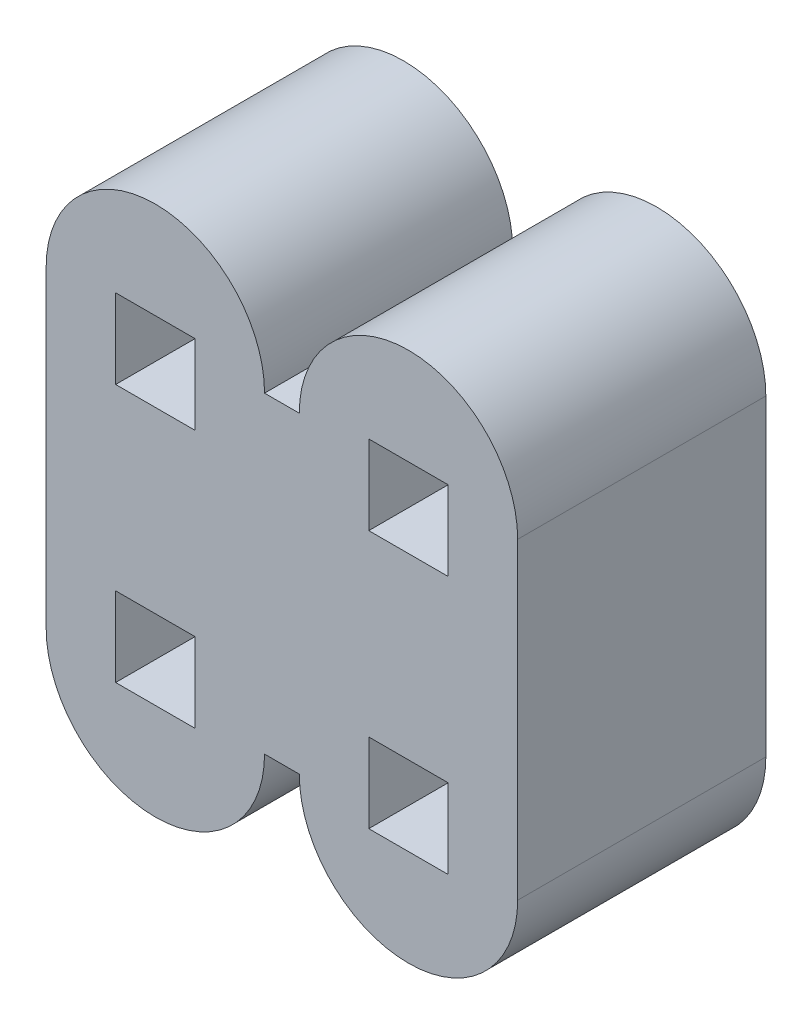
ISO-10303-21;
HEADER;
FILE_DESCRIPTION(('STEP AP214'),'2;1');
FILE_NAME('part.step','',(''),(''),'','','');
FILE_SCHEMA(('AUTOMOTIVE_DESIGN { 1 0 10303 214 1 1 1 1 }'));
ENDSEC;
DATA;
#1=APPLICATION_CONTEXT('core data for automotive mechanical design processes');
#2=APPLICATION_PROTOCOL_DEFINITION('international standard','automotive_design',2000,#1);
#3=PRODUCT_CONTEXT('',#1,'mechanical');
#4=PRODUCT('Part','Part','',(#3));
#5=PRODUCT_RELATED_PRODUCT_CATEGORY('part','',(#4));
#6=PRODUCT_DEFINITION_FORMATION('','',#4);
#7=PRODUCT_DEFINITION_CONTEXT('part definition',#1,'design');
#8=PRODUCT_DEFINITION('design','',#6,#7);
#9=PRODUCT_DEFINITION_SHAPE('','',#8);
#10=(LENGTH_UNIT() NAMED_UNIT(*) SI_UNIT(.MILLI.,.METRE.));
#11=(NAMED_UNIT(*) PLANE_ANGLE_UNIT() SI_UNIT($,.RADIAN.));
#12=(NAMED_UNIT(*) SI_UNIT($,.STERADIAN.) SOLID_ANGLE_UNIT());
#13=UNCERTAINTY_MEASURE_WITH_UNIT(LENGTH_MEASURE(1.E-05),#10,'distance_accuracy_value','');
#14=(GEOMETRIC_REPRESENTATION_CONTEXT(3) GLOBAL_UNCERTAINTY_ASSIGNED_CONTEXT((#13)) GLOBAL_UNIT_ASSIGNED_CONTEXT((#10,
#11,#12)) REPRESENTATION_CONTEXT('',''));
#15=CARTESIAN_POINT('',(0.,0.,0.));
#16=DIRECTION('',(0.,0.,1.));
#17=DIRECTION('',(1.,0.,0.));
#18=AXIS2_PLACEMENT_3D('',#15,#16,#17);
#19=CARTESIAN_POINT('',(-13.9966399599787,-19.5900833063968,2.5));
#20=DIRECTION('',(0.,0.,-1.));
#21=DIRECTION('',(-1.,0.,0.));
#22=AXIS2_PLACEMENT_3D('',#19,#20,#21);
#23=CYLINDRICAL_SURFACE('',#22,1.1);
#24=CARTESIAN_POINT('',(-13.9966399599787,-19.5900833063968,0.));
#25=DIRECTION('',(0.,0.,1.));
#26=DIRECTION('',(1.,0.,0.));
#27=AXIS2_PLACEMENT_3D('',#24,#25,#26);
#28=CIRCLE('',#27,1.1);
#29=CARTESIAN_POINT('',(-15.0966399599787,-19.5900833063968,0.));
#30=VERTEX_POINT('',#29);
#31=CARTESIAN_POINT('',(-12.8966399599787,-19.5900833063968,0.));
#32=VERTEX_POINT('',#31);
#33=EDGE_CURVE('E320',#30,#32,#28,.T.);
#34=ORIENTED_EDGE('',*,*,#33,.T.);
#35=DIRECTION('',(0.,0.,-1.));
#36=VECTOR('',#35,1.);
#37=CARTESIAN_POINT('',(-12.8966399599787,-19.5900833063968,2.5));
#38=LINE('',#37,#36);
#39=CARTESIAN_POINT('',(-12.8966399599787,-19.5900833063968,2.5));
#40=VERTEX_POINT('',#39);
#41=EDGE_CURVE('E11',#40,#32,#38,.T.);
#42=ORIENTED_EDGE('',*,*,#41,.F.);
#43=CARTESIAN_POINT('',(-13.9966399599787,-19.5900833063968,2.5));
#44=DIRECTION('',(0.,0.,1.));
#45=DIRECTION('',(1.,0.,0.));
#46=AXIS2_PLACEMENT_3D('',#43,#44,#45);
#47=CIRCLE('',#46,1.1);
#48=CARTESIAN_POINT('',(-15.0966399599787,-19.5900833063968,2.5));
#49=VERTEX_POINT('',#48);
#50=EDGE_CURVE('E327',#49,#40,#47,.T.);
#51=ORIENTED_EDGE('',*,*,#50,.F.);
#52=DIRECTION('',(0.,0.,-1.));
#53=VECTOR('',#52,1.);
#54=CARTESIAN_POINT('',(-15.0966399599787,-19.5900833063968,2.5));
#55=LINE('',#54,#53);
#56=EDGE_CURVE('E347',#49,#30,#55,.T.);
#57=ORIENTED_EDGE('',*,*,#56,.T.);
#58=EDGE_LOOP('',(#34,#42,#51,#57));
#59=FACE_BOUND('',#58,.T.);
#60=ADVANCED_FACE('F34',(#59),#23,.T.);
#61=CARTESIAN_POINT('',(0.,-19.5900833063968,2.5));
#62=DIRECTION('',(0.,1.,0.));
#63=DIRECTION('',(0.,0.,1.));
#64=AXIS2_PLACEMENT_3D('',#61,#62,#63);
#65=PLANE('',#64);
#66=DIRECTION('',(1.,0.,0.));
#67=VECTOR('',#66,1.);
#68=CARTESIAN_POINT('',(0.,-19.5900833063968,0.));
#69=LINE('',#68,#67);
#70=CARTESIAN_POINT('',(-12.5466399599787,-19.5900833063968,0.));
#71=VERTEX_POINT('',#70);
#72=EDGE_CURVE('E350',#32,#71,#69,.T.);
#73=ORIENTED_EDGE('',*,*,#72,.T.);
#74=DIRECTION('',(0.,0.,-1.));
#75=VECTOR('',#74,1.);
#76=CARTESIAN_POINT('',(-12.5466399599787,-19.5900833063968,2.5));
#77=LINE('',#76,#75);
#78=CARTESIAN_POINT('',(-12.5466399599787,-19.5900833063968,2.5));
#79=VERTEX_POINT('',#78);
#80=EDGE_CURVE('E41',#79,#71,#77,.T.);
#81=ORIENTED_EDGE('',*,*,#80,.F.);
#82=DIRECTION('',(1.,0.,0.));
#83=VECTOR('',#82,1.);
#84=CARTESIAN_POINT('',(0.,-19.5900833063968,2.5));
#85=LINE('',#84,#83);
#86=EDGE_CURVE('E330',#40,#79,#85,.T.);
#87=ORIENTED_EDGE('',*,*,#86,.F.);
#88=ORIENTED_EDGE('',*,*,#41,.T.);
#89=EDGE_LOOP('',(#73,#81,#87,#88));
#90=FACE_BOUND('',#89,.T.);
#91=ADVANCED_FACE('F405',(#90),#65,.F.);
#92=CARTESIAN_POINT('',(-11.4466399599787,-19.5900833063968,2.5));
#93=DIRECTION('',(0.,0.,-1.));
#94=DIRECTION('',(-1.,0.,0.));
#95=AXIS2_PLACEMENT_3D('',#92,#93,#94);
#96=CYLINDRICAL_SURFACE('',#95,1.1);
#97=CARTESIAN_POINT('',(-11.4466399599787,-19.5900833063968,0.));
#98=DIRECTION('',(0.,0.,1.));
#99=DIRECTION('',(1.,0.,0.));
#100=AXIS2_PLACEMENT_3D('',#97,#98,#99);
#101=CIRCLE('',#100,1.1);
#102=CARTESIAN_POINT('',(-10.3466399599787,-19.5900833063968,0.));
#103=VERTEX_POINT('',#102);
#104=EDGE_CURVE('E352',#71,#103,#101,.T.);
#105=ORIENTED_EDGE('',*,*,#104,.T.);
#106=DIRECTION('',(0.,0.,-1.));
#107=VECTOR('',#106,1.);
#108=CARTESIAN_POINT('',(-10.3466399599787,-19.5900833063968,2.5));
#109=LINE('',#108,#107);
#110=CARTESIAN_POINT('',(-10.3466399599787,-19.5900833063968,2.5));
#111=VERTEX_POINT('',#110);
#112=EDGE_CURVE('E377',#111,#103,#109,.T.);
#113=ORIENTED_EDGE('',*,*,#112,.F.);
#114=CARTESIAN_POINT('',(-11.4466399599787,-19.5900833063968,2.5));
#115=DIRECTION('',(0.,0.,1.));
#116=DIRECTION('',(1.,0.,0.));
#117=AXIS2_PLACEMENT_3D('',#114,#115,#116);
#118=CIRCLE('',#117,1.1);
#119=EDGE_CURVE('E333',#79,#111,#118,.T.);
#120=ORIENTED_EDGE('',*,*,#119,.F.);
#121=ORIENTED_EDGE('',*,*,#80,.T.);
#122=EDGE_LOOP('',(#105,#113,#120,#121));
#123=FACE_BOUND('',#122,.T.);
#124=ADVANCED_FACE('F384',(#123),#96,.T.);
#125=CARTESIAN_POINT('',(-10.3466399599787,0.,2.5));
#126=DIRECTION('',(-1.,0.,0.));
#127=DIRECTION('',(0.,0.,1.));
#128=AXIS2_PLACEMENT_3D('',#125,#126,#127);
#129=PLANE('',#128);
#130=DIRECTION('',(0.,1.,0.));
#131=VECTOR('',#130,1.);
#132=CARTESIAN_POINT('',(-10.3466399599787,0.,0.));
#133=LINE('',#132,#131);
#134=CARTESIAN_POINT('',(-10.3466399599787,-16.4413177073221,0.));
#135=VERTEX_POINT('',#134);
#136=EDGE_CURVE('E354',#103,#135,#133,.T.);
#137=ORIENTED_EDGE('',*,*,#136,.T.);
#138=DIRECTION('',(0.,0.,-1.));
#139=VECTOR('',#138,1.);
#140=CARTESIAN_POINT('',(-10.3466399599787,-16.4413177073221,2.5));
#141=LINE('',#140,#139);
#142=CARTESIAN_POINT('',(-10.3466399599787,-16.4413177073221,2.5));
#143=VERTEX_POINT('',#142);
#144=EDGE_CURVE('E374',#143,#135,#141,.T.);
#145=ORIENTED_EDGE('',*,*,#144,.F.);
#146=DIRECTION('',(0.,1.,0.));
#147=VECTOR('',#146,1.);
#148=CARTESIAN_POINT('',(-10.3466399599787,0.,2.5));
#149=LINE('',#148,#147);
#150=EDGE_CURVE('E335',#111,#143,#149,.T.);
#151=ORIENTED_EDGE('',*,*,#150,.F.);
#152=ORIENTED_EDGE('',*,*,#112,.T.);
#153=EDGE_LOOP('',(#137,#145,#151,#152));
#154=FACE_BOUND('',#153,.T.);
#155=ADVANCED_FACE('F393',(#154),#129,.F.);
#156=CARTESIAN_POINT('',(-11.4466399599787,-16.4413177073221,2.5));
#157=DIRECTION('',(0.,0.,-1.));
#158=DIRECTION('',(-1.,0.,0.));
#159=AXIS2_PLACEMENT_3D('',#156,#157,#158);
#160=CYLINDRICAL_SURFACE('',#159,1.1);
#161=CARTESIAN_POINT('',(-11.4466399599787,-16.4413177073221,0.));
#162=DIRECTION('',(0.,0.,1.));
#163=DIRECTION('',(1.,0.,0.));
#164=AXIS2_PLACEMENT_3D('',#161,#162,#163);
#165=CIRCLE('',#164,1.1);
#166=CARTESIAN_POINT('',(-12.5466399599787,-16.4413177073221,0.));
#167=VERTEX_POINT('',#166);
#168=EDGE_CURVE('E356',#135,#167,#165,.T.);
#169=ORIENTED_EDGE('',*,*,#168,.T.);
#170=DIRECTION('',(0.,0.,-1.));
#171=VECTOR('',#170,1.);
#172=CARTESIAN_POINT('',(-12.5466399599787,-16.4413177073221,2.5));
#173=LINE('',#172,#171);
#174=CARTESIAN_POINT('',(-12.5466399599787,-16.4413177073221,2.5));
#175=VERTEX_POINT('',#174);
#176=EDGE_CURVE('E372',#175,#167,#173,.T.);
#177=ORIENTED_EDGE('',*,*,#176,.F.);
#178=CARTESIAN_POINT('',(-11.4466399599787,-16.4413177073221,2.5));
#179=DIRECTION('',(0.,0.,1.));
#180=DIRECTION('',(1.,0.,0.));
#181=AXIS2_PLACEMENT_3D('',#178,#179,#180);
#182=CIRCLE('',#181,1.1);
#183=EDGE_CURVE('E337',#143,#175,#182,.T.);
#184=ORIENTED_EDGE('',*,*,#183,.F.);
#185=ORIENTED_EDGE('',*,*,#144,.T.);
#186=EDGE_LOOP('',(#169,#177,#184,#185));
#187=FACE_BOUND('',#186,.T.);
#188=ADVANCED_FACE('F397',(#187),#160,.T.);
#189=CARTESIAN_POINT('',(0.,-16.4413177073221,2.5));
#190=DIRECTION('',(0.,1.,0.));
#191=DIRECTION('',(0.,0.,1.));
#192=AXIS2_PLACEMENT_3D('',#189,#190,#191);
#193=PLANE('',#192);
#194=DIRECTION('',(1.,0.,0.));
#195=VECTOR('',#194,1.);
#196=CARTESIAN_POINT('',(0.,-16.4413177073221,0.));
#197=LINE('',#196,#195);
#198=CARTESIAN_POINT('',(-12.8966399599787,-16.4413177073221,0.));
#199=VERTEX_POINT('',#198);
#200=EDGE_CURVE('E359',#199,#167,#197,.T.);
#201=ORIENTED_EDGE('',*,*,#200,.F.);
#202=DIRECTION('',(0.,0.,-1.));
#203=VECTOR('',#202,1.);
#204=CARTESIAN_POINT('',(-12.8966399599787,-16.4413177073221,2.5));
#205=LINE('',#204,#203);
#206=CARTESIAN_POINT('',(-12.8966399599787,-16.4413177073221,2.5));
#207=VERTEX_POINT('',#206);
#208=EDGE_CURVE('E370',#207,#199,#205,.T.);
#209=ORIENTED_EDGE('',*,*,#208,.F.);
#210=DIRECTION('',(1.,0.,0.));
#211=VECTOR('',#210,1.);
#212=CARTESIAN_POINT('',(0.,-16.4413177073221,2.5));
#213=LINE('',#212,#211);
#214=EDGE_CURVE('E339',#207,#175,#213,.T.);
#215=ORIENTED_EDGE('',*,*,#214,.T.);
#216=ORIENTED_EDGE('',*,*,#176,.T.);
#217=EDGE_LOOP('',(#201,#209,#215,#216));
#218=FACE_BOUND('',#217,.T.);
#219=ADVANCED_FACE('F417',(#218),#193,.T.);
#220=CARTESIAN_POINT('',(-13.9966399599787,-16.4413177073221,2.5));
#221=DIRECTION('',(0.,0.,-1.));
#222=DIRECTION('',(-1.,0.,0.));
#223=AXIS2_PLACEMENT_3D('',#220,#221,#222);
#224=CYLINDRICAL_SURFACE('',#223,1.1);
#225=CARTESIAN_POINT('',(-13.9966399599787,-16.4413177073221,0.));
#226=DIRECTION('',(0.,0.,1.));
#227=DIRECTION('',(1.,0.,0.));
#228=AXIS2_PLACEMENT_3D('',#225,#226,#227);
#229=CIRCLE('',#228,1.1);
#230=CARTESIAN_POINT('',(-15.0966399599787,-16.4413177073221,0.));
#231=VERTEX_POINT('',#230);
#232=EDGE_CURVE('E362',#199,#231,#229,.T.);
#233=ORIENTED_EDGE('',*,*,#232,.T.);
#234=DIRECTION('',(0.,0.,-1.));
#235=VECTOR('',#234,1.);
#236=CARTESIAN_POINT('',(-15.0966399599787,-16.4413177073221,2.5));
#237=LINE('',#236,#235);
#238=CARTESIAN_POINT('',(-15.0966399599787,-16.4413177073221,2.5));
#239=VERTEX_POINT('',#238);
#240=EDGE_CURVE('E368',#239,#231,#237,.T.);
#241=ORIENTED_EDGE('',*,*,#240,.F.);
#242=CARTESIAN_POINT('',(-13.9966399599787,-16.4413177073221,2.5));
#243=DIRECTION('',(0.,0.,1.));
#244=DIRECTION('',(1.,0.,0.));
#245=AXIS2_PLACEMENT_3D('',#242,#243,#244);
#246=CIRCLE('',#245,1.1);
#247=EDGE_CURVE('E342',#207,#239,#246,.T.);
#248=ORIENTED_EDGE('',*,*,#247,.F.);
#249=ORIENTED_EDGE('',*,*,#208,.T.);
#250=EDGE_LOOP('',(#233,#241,#248,#249));
#251=FACE_BOUND('',#250,.T.);
#252=ADVANCED_FACE('F414',(#251),#224,.T.);
#253=CARTESIAN_POINT('',(-15.0966399599787,0.,2.5));
#254=DIRECTION('',(-1.,0.,0.));
#255=DIRECTION('',(0.,0.,1.));
#256=AXIS2_PLACEMENT_3D('',#253,#254,#255);
#257=PLANE('',#256);
#258=DIRECTION('',(0.,1.,0.));
#259=VECTOR('',#258,1.);
#260=CARTESIAN_POINT('',(-15.0966399599787,0.,0.));
#261=LINE('',#260,#259);
#262=EDGE_CURVE('E331',#30,#231,#261,.T.);
#263=ORIENTED_EDGE('',*,*,#262,.F.);
#264=ORIENTED_EDGE('',*,*,#56,.F.);
#265=DIRECTION('',(0.,1.,0.));
#266=VECTOR('',#265,1.);
#267=CARTESIAN_POINT('',(-15.0966399599787,0.,2.5));
#268=LINE('',#267,#266);
#269=EDGE_CURVE('E344',#49,#239,#268,.T.);
#270=ORIENTED_EDGE('',*,*,#269,.T.);
#271=ORIENTED_EDGE('',*,*,#240,.T.);
#272=EDGE_LOOP('',(#263,#264,#270,#271));
#273=FACE_BOUND('',#272,.T.);
#274=ADVANCED_FACE('F410',(#273),#257,.T.);
#275=CARTESIAN_POINT('',(0.,0.,2.5));
#276=DIRECTION('',(0.,0.,1.));
#277=DIRECTION('',(1.,0.,0.));
#278=AXIS2_PLACEMENT_3D('',#275,#276,#277);
#279=PLANE('',#278);
#280=DIRECTION('',(0.,-1.,0.));
#281=VECTOR('',#280,1.);
#282=CARTESIAN_POINT('',(-11.8466399599787,-18.9157005068595,2.5));
#283=LINE('',#282,#281);
#284=CARTESIAN_POINT('',(-11.8466399599787,-18.9157005068595,2.5));
#285=VERTEX_POINT('',#284);
#286=CARTESIAN_POINT('',(-11.8466399599787,-19.7157005068595,2.5));
#287=VERTEX_POINT('',#286);
#288=EDGE_CURVE('E48',#285,#287,#283,.T.);
#289=ORIENTED_EDGE('',*,*,#288,.F.);
#290=DIRECTION('',(-1.,0.,0.));
#291=VECTOR('',#290,1.);
#292=CARTESIAN_POINT('',(-11.8466399599787,-18.9157005068595,2.5));
#293=LINE('',#292,#291);
#294=CARTESIAN_POINT('',(-11.0466399599787,-18.9157005068595,2.5));
#295=VERTEX_POINT('',#294);
#296=EDGE_CURVE('E212',#295,#285,#293,.T.);
#297=ORIENTED_EDGE('',*,*,#296,.F.);
#298=DIRECTION('',(0.,1.,0.));
#299=VECTOR('',#298,1.);
#300=CARTESIAN_POINT('',(-11.0466399599787,-18.9157005068595,2.5));
#301=LINE('',#300,#299);
#302=CARTESIAN_POINT('',(-11.0466399599787,-19.7157005068595,2.5));
#303=VERTEX_POINT('',#302);
#304=EDGE_CURVE('E215',#303,#295,#301,.T.);
#305=ORIENTED_EDGE('',*,*,#304,.F.);
#306=DIRECTION('',(1.,0.,0.));
#307=VECTOR('',#306,1.);
#308=CARTESIAN_POINT('',(-11.8466399599787,-19.7157005068595,2.5));
#309=LINE('',#308,#307);
#310=EDGE_CURVE('E221',#287,#303,#309,.T.);
#311=ORIENTED_EDGE('',*,*,#310,.F.);
#312=EDGE_LOOP('',(#289,#297,#305,#311));
#313=FACE_BOUND('',#312,.T.);
#314=DIRECTION('',(0.,-1.,0.));
#315=VECTOR('',#314,1.);
#316=CARTESIAN_POINT('',(-11.8466399599787,-16.3157005068595,2.5));
#317=LINE('',#316,#315);
#318=CARTESIAN_POINT('',(-11.8466399599787,-16.3157005068595,2.5));
#319=VERTEX_POINT('',#318);
#320=CARTESIAN_POINT('',(-11.8466399599787,-17.1157005068595,2.5));
#321=VERTEX_POINT('',#320);
#322=EDGE_CURVE('E227',#319,#321,#317,.T.);
#323=ORIENTED_EDGE('',*,*,#322,.F.);
#324=DIRECTION('',(-1.,0.,0.));
#325=VECTOR('',#324,1.);
#326=CARTESIAN_POINT('',(-11.8466399599787,-16.3157005068595,2.5));
#327=LINE('',#326,#325);
#328=CARTESIAN_POINT('',(-11.0466399599787,-16.3157005068595,2.5));
#329=VERTEX_POINT('',#328);
#330=EDGE_CURVE('E235',#329,#319,#327,.T.);
#331=ORIENTED_EDGE('',*,*,#330,.F.);
#332=DIRECTION('',(0.,1.,0.));
#333=VECTOR('',#332,1.);
#334=CARTESIAN_POINT('',(-11.0466399599787,-16.3157005068595,2.5));
#335=LINE('',#334,#333);
#336=CARTESIAN_POINT('',(-11.0466399599787,-17.1157005068595,2.5));
#337=VERTEX_POINT('',#336);
#338=EDGE_CURVE('E249',#337,#329,#335,.T.);
#339=ORIENTED_EDGE('',*,*,#338,.F.);
#340=DIRECTION('',(1.,0.,0.));
#341=VECTOR('',#340,1.);
#342=CARTESIAN_POINT('',(-11.8466399599787,-17.1157005068595,2.5));
#343=LINE('',#342,#341);
#344=EDGE_CURVE('E246',#321,#337,#343,.T.);
#345=ORIENTED_EDGE('',*,*,#344,.F.);
#346=EDGE_LOOP('',(#323,#331,#339,#345));
#347=FACE_BOUND('',#346,.T.);
#348=DIRECTION('',(0.,-1.,0.));
#349=VECTOR('',#348,1.);
#350=CARTESIAN_POINT('',(-14.3966399599787,-18.9157005068595,2.5));
#351=LINE('',#350,#349);
#352=CARTESIAN_POINT('',(-14.3966399599787,-18.9157005068595,2.5));
#353=VERTEX_POINT('',#352);
#354=CARTESIAN_POINT('',(-14.3966399599787,-19.7157005068595,2.5));
#355=VERTEX_POINT('',#354);
#356=EDGE_CURVE('E256',#353,#355,#351,.T.);
#357=ORIENTED_EDGE('',*,*,#356,.F.);
#358=DIRECTION('',(-1.,0.,0.));
#359=VECTOR('',#358,1.);
#360=CARTESIAN_POINT('',(-14.3966399599787,-18.9157005068595,2.5));
#361=LINE('',#360,#359);
#362=CARTESIAN_POINT('',(-13.5966399599787,-18.9157005068595,2.5));
#363=VERTEX_POINT('',#362);
#364=EDGE_CURVE('E267',#363,#353,#361,.T.);
#365=ORIENTED_EDGE('',*,*,#364,.F.);
#366=DIRECTION('',(0.,1.,0.));
#367=VECTOR('',#366,1.);
#368=CARTESIAN_POINT('',(-13.5966399599787,-18.9157005068595,2.5));
#369=LINE('',#368,#367);
#370=CARTESIAN_POINT('',(-13.5966399599787,-19.7157005068595,2.5));
#371=VERTEX_POINT('',#370);
#372=EDGE_CURVE('E281',#371,#363,#369,.T.);
#373=ORIENTED_EDGE('',*,*,#372,.F.);
#374=DIRECTION('',(1.,0.,0.));
#375=VECTOR('',#374,1.);
#376=CARTESIAN_POINT('',(-14.3966399599787,-19.7157005068595,2.5));
#377=LINE('',#376,#375);
#378=EDGE_CURVE('E278',#355,#371,#377,.T.);
#379=ORIENTED_EDGE('',*,*,#378,.F.);
#380=EDGE_LOOP('',(#357,#365,#373,#379));
#381=FACE_BOUND('',#380,.T.);
#382=DIRECTION('',(0.,-1.,0.));
#383=VECTOR('',#382,1.);
#384=CARTESIAN_POINT('',(-14.3966399599787,-16.3157005068595,2.5));
#385=LINE('',#384,#383);
#386=CARTESIAN_POINT('',(-14.3966399599787,-16.3157005068595,2.5));
#387=VERTEX_POINT('',#386);
#388=CARTESIAN_POINT('',(-14.3966399599787,-17.1157005068595,2.5));
#389=VERTEX_POINT('',#388);
#390=EDGE_CURVE('E288',#387,#389,#385,.T.);
#391=ORIENTED_EDGE('',*,*,#390,.F.);
#392=DIRECTION('',(-1.,0.,0.));
#393=VECTOR('',#392,1.);
#394=CARTESIAN_POINT('',(-14.3966399599787,-16.3157005068595,2.5));
#395=LINE('',#394,#393);
#396=CARTESIAN_POINT('',(-13.5966399599787,-16.3157005068595,2.5));
#397=VERTEX_POINT('',#396);
#398=EDGE_CURVE('E299',#397,#387,#395,.T.);
#399=ORIENTED_EDGE('',*,*,#398,.F.);
#400=DIRECTION('',(0.,1.,0.));
#401=VECTOR('',#400,1.);
#402=CARTESIAN_POINT('',(-13.5966399599787,-16.3157005068595,2.5));
#403=LINE('',#402,#401);
#404=CARTESIAN_POINT('',(-13.5966399599787,-17.1157005068595,2.5));
#405=VERTEX_POINT('',#404);
#406=EDGE_CURVE('E313',#405,#397,#403,.T.);
#407=ORIENTED_EDGE('',*,*,#406,.F.);
#408=DIRECTION('',(1.,0.,0.));
#409=VECTOR('',#408,1.);
#410=CARTESIAN_POINT('',(-14.3966399599787,-17.1157005068595,2.5));
#411=LINE('',#410,#409);
#412=EDGE_CURVE('E310',#389,#405,#411,.T.);
#413=ORIENTED_EDGE('',*,*,#412,.F.);
#414=EDGE_LOOP('',(#391,#399,#407,#413));
#415=FACE_BOUND('',#414,.T.);
#416=ORIENTED_EDGE('',*,*,#50,.T.);
#417=ORIENTED_EDGE('',*,*,#86,.T.);
#418=ORIENTED_EDGE('',*,*,#119,.T.);
#419=ORIENTED_EDGE('',*,*,#150,.T.);
#420=ORIENTED_EDGE('',*,*,#183,.T.);
#421=ORIENTED_EDGE('',*,*,#214,.F.);
#422=ORIENTED_EDGE('',*,*,#247,.T.);
#423=ORIENTED_EDGE('',*,*,#269,.F.);
#424=EDGE_LOOP('',(#416,#417,#418,#419,#420,#421,#422,#423));
#425=FACE_BOUND('',#424,.T.);
#426=ADVANCED_FACE('F401',(#313,#347,#381,#415,#425),#279,.T.);
#427=CARTESIAN_POINT('',(0.,0.,0.));
#428=DIRECTION('',(0.,0.,1.));
#429=DIRECTION('',(1.,0.,0.));
#430=AXIS2_PLACEMENT_3D('',#427,#428,#429);
#431=PLANE('',#430);
#432=DIRECTION('',(-1.,0.,0.));
#433=VECTOR('',#432,1.);
#434=CARTESIAN_POINT('',(-11.8466399599787,-18.9157005068595,0.));
#435=LINE('',#434,#433);
#436=CARTESIAN_POINT('',(-11.0466399599787,-18.9157005068595,0.));
#437=VERTEX_POINT('',#436);
#438=CARTESIAN_POINT('',(-11.8466399599787,-18.9157005068595,0.));
#439=VERTEX_POINT('',#438);
#440=EDGE_CURVE('E202',#437,#439,#435,.T.);
#441=ORIENTED_EDGE('',*,*,#440,.T.);
#442=DIRECTION('',(0.,-1.,0.));
#443=VECTOR('',#442,1.);
#444=CARTESIAN_POINT('',(-11.8466399599787,-18.9157005068595,0.));
#445=LINE('',#444,#443);
#446=CARTESIAN_POINT('',(-11.8466399599787,-19.7157005068595,0.));
#447=VERTEX_POINT('',#446);
#448=EDGE_CURVE('E196',#439,#447,#445,.T.);
#449=ORIENTED_EDGE('',*,*,#448,.T.);
#450=DIRECTION('',(1.,0.,0.));
#451=VECTOR('',#450,1.);
#452=CARTESIAN_POINT('',(-11.8466399599787,-19.7157005068595,0.));
#453=LINE('',#452,#451);
#454=CARTESIAN_POINT('',(-11.0466399599787,-19.7157005068595,0.));
#455=VERTEX_POINT('',#454);
#456=EDGE_CURVE('E205',#447,#455,#453,.T.);
#457=ORIENTED_EDGE('',*,*,#456,.T.);
#458=DIRECTION('',(0.,1.,0.));
#459=VECTOR('',#458,1.);
#460=CARTESIAN_POINT('',(-11.0466399599787,-18.9157005068595,0.));
#461=LINE('',#460,#459);
#462=EDGE_CURVE('E56',#455,#437,#461,.T.);
#463=ORIENTED_EDGE('',*,*,#462,.T.);
#464=EDGE_LOOP('',(#441,#449,#457,#463));
#465=FACE_BOUND('',#464,.T.);
#466=DIRECTION('',(-1.,0.,0.));
#467=VECTOR('',#466,1.);
#468=CARTESIAN_POINT('',(-11.8466399599787,-16.3157005068595,0.));
#469=LINE('',#468,#467);
#470=CARTESIAN_POINT('',(-11.0466399599787,-16.3157005068595,0.));
#471=VERTEX_POINT('',#470);
#472=CARTESIAN_POINT('',(-11.8466399599787,-16.3157005068595,0.));
#473=VERTEX_POINT('',#472);
#474=EDGE_CURVE('E241',#471,#473,#469,.T.);
#475=ORIENTED_EDGE('',*,*,#474,.T.);
#476=DIRECTION('',(0.,-1.,0.));
#477=VECTOR('',#476,1.);
#478=CARTESIAN_POINT('',(-11.8466399599787,-16.3157005068595,0.));
#479=LINE('',#478,#477);
#480=CARTESIAN_POINT('',(-11.8466399599787,-17.1157005068595,0.));
#481=VERTEX_POINT('',#480);
#482=EDGE_CURVE('E231',#473,#481,#479,.T.);
#483=ORIENTED_EDGE('',*,*,#482,.T.);
#484=DIRECTION('',(1.,0.,0.));
#485=VECTOR('',#484,1.);
#486=CARTESIAN_POINT('',(-11.8466399599787,-17.1157005068595,0.));
#487=LINE('',#486,#485);
#488=CARTESIAN_POINT('',(-11.0466399599787,-17.1157005068595,0.));
#489=VERTEX_POINT('',#488);
#490=EDGE_CURVE('E234',#481,#489,#487,.T.);
#491=ORIENTED_EDGE('',*,*,#490,.T.);
#492=DIRECTION('',(0.,1.,0.));
#493=VECTOR('',#492,1.);
#494=CARTESIAN_POINT('',(-11.0466399599787,-16.3157005068595,0.));
#495=LINE('',#494,#493);
#496=EDGE_CURVE('E238',#489,#471,#495,.T.);
#497=ORIENTED_EDGE('',*,*,#496,.T.);
#498=EDGE_LOOP('',(#475,#483,#491,#497));
#499=FACE_BOUND('',#498,.T.);
#500=DIRECTION('',(-1.,0.,0.));
#501=VECTOR('',#500,1.);
#502=CARTESIAN_POINT('',(-14.3966399599787,-18.9157005068595,0.));
#503=LINE('',#502,#501);
#504=CARTESIAN_POINT('',(-13.5966399599787,-18.9157005068595,0.));
#505=VERTEX_POINT('',#504);
#506=CARTESIAN_POINT('',(-14.3966399599787,-18.9157005068595,0.));
#507=VERTEX_POINT('',#506);
#508=EDGE_CURVE('E273',#505,#507,#503,.T.);
#509=ORIENTED_EDGE('',*,*,#508,.T.);
#510=DIRECTION('',(0.,-1.,0.));
#511=VECTOR('',#510,1.);
#512=CARTESIAN_POINT('',(-14.3966399599787,-18.9157005068595,0.));
#513=LINE('',#512,#511);
#514=CARTESIAN_POINT('',(-14.3966399599787,-19.7157005068595,0.));
#515=VERTEX_POINT('',#514);
#516=EDGE_CURVE('E263',#507,#515,#513,.T.);
#517=ORIENTED_EDGE('',*,*,#516,.T.);
#518=DIRECTION('',(1.,0.,0.));
#519=VECTOR('',#518,1.);
#520=CARTESIAN_POINT('',(-14.3966399599787,-19.7157005068595,0.));
#521=LINE('',#520,#519);
#522=CARTESIAN_POINT('',(-13.5966399599787,-19.7157005068595,0.));
#523=VERTEX_POINT('',#522);
#524=EDGE_CURVE('E266',#515,#523,#521,.T.);
#525=ORIENTED_EDGE('',*,*,#524,.T.);
#526=DIRECTION('',(0.,1.,0.));
#527=VECTOR('',#526,1.);
#528=CARTESIAN_POINT('',(-13.5966399599787,-18.9157005068595,0.));
#529=LINE('',#528,#527);
#530=EDGE_CURVE('E270',#523,#505,#529,.T.);
#531=ORIENTED_EDGE('',*,*,#530,.T.);
#532=EDGE_LOOP('',(#509,#517,#525,#531));
#533=FACE_BOUND('',#532,.T.);
#534=DIRECTION('',(-1.,0.,0.));
#535=VECTOR('',#534,1.);
#536=CARTESIAN_POINT('',(-14.3966399599787,-16.3157005068595,0.));
#537=LINE('',#536,#535);
#538=CARTESIAN_POINT('',(-13.5966399599787,-16.3157005068595,0.));
#539=VERTEX_POINT('',#538);
#540=CARTESIAN_POINT('',(-14.3966399599787,-16.3157005068595,0.));
#541=VERTEX_POINT('',#540);
#542=EDGE_CURVE('E305',#539,#541,#537,.T.);
#543=ORIENTED_EDGE('',*,*,#542,.T.);
#544=DIRECTION('',(0.,-1.,0.));
#545=VECTOR('',#544,1.);
#546=CARTESIAN_POINT('',(-14.3966399599787,-16.3157005068595,0.));
#547=LINE('',#546,#545);
#548=CARTESIAN_POINT('',(-14.3966399599787,-17.1157005068595,0.));
#549=VERTEX_POINT('',#548);
#550=EDGE_CURVE('E295',#541,#549,#547,.T.);
#551=ORIENTED_EDGE('',*,*,#550,.T.);
#552=DIRECTION('',(1.,0.,0.));
#553=VECTOR('',#552,1.);
#554=CARTESIAN_POINT('',(-14.3966399599787,-17.1157005068595,0.));
#555=LINE('',#554,#553);
#556=CARTESIAN_POINT('',(-13.5966399599787,-17.1157005068595,0.));
#557=VERTEX_POINT('',#556);
#558=EDGE_CURVE('E298',#549,#557,#555,.T.);
#559=ORIENTED_EDGE('',*,*,#558,.T.);
#560=DIRECTION('',(0.,1.,0.));
#561=VECTOR('',#560,1.);
#562=CARTESIAN_POINT('',(-13.5966399599787,-16.3157005068595,0.));
#563=LINE('',#562,#561);
#564=EDGE_CURVE('E302',#557,#539,#563,.T.);
#565=ORIENTED_EDGE('',*,*,#564,.T.);
#566=EDGE_LOOP('',(#543,#551,#559,#565));
#567=FACE_BOUND('',#566,.T.);
#568=ORIENTED_EDGE('',*,*,#33,.F.);
#569=ORIENTED_EDGE('',*,*,#262,.T.);
#570=ORIENTED_EDGE('',*,*,#232,.F.);
#571=ORIENTED_EDGE('',*,*,#200,.T.);
#572=ORIENTED_EDGE('',*,*,#168,.F.);
#573=ORIENTED_EDGE('',*,*,#136,.F.);
#574=ORIENTED_EDGE('',*,*,#104,.F.);
#575=ORIENTED_EDGE('',*,*,#72,.F.);
#576=EDGE_LOOP('',(#568,#569,#570,#571,#572,#573,#574,#575));
#577=FACE_BOUND('',#576,.T.);
#578=ADVANCED_FACE('F209',(#465,#499,#533,#567,#577),#431,.F.);
#579=CARTESIAN_POINT('',(-14.3966399599787,-16.3157005068595,0.));
#580=DIRECTION('',(-1.,0.,0.));
#581=DIRECTION('',(0.,0.,1.));
#582=AXIS2_PLACEMENT_3D('',#579,#580,#581);
#583=PLANE('',#582);
#584=ORIENTED_EDGE('',*,*,#390,.T.);
#585=DIRECTION('',(0.,0.,1.));
#586=VECTOR('',#585,1.);
#587=CARTESIAN_POINT('',(-14.3966399599787,-17.1157005068595,0.));
#588=LINE('',#587,#586);
#589=EDGE_CURVE('E308',#549,#389,#588,.T.);
#590=ORIENTED_EDGE('',*,*,#589,.F.);
#591=ORIENTED_EDGE('',*,*,#550,.F.);
#592=DIRECTION('',(0.,0.,1.));
#593=VECTOR('',#592,1.);
#594=CARTESIAN_POINT('',(-14.3966399599787,-16.3157005068595,0.));
#595=LINE('',#594,#593);
#596=EDGE_CURVE('E318',#541,#387,#595,.T.);
#597=ORIENTED_EDGE('',*,*,#596,.T.);
#598=EDGE_LOOP('',(#584,#590,#591,#597));
#599=FACE_BOUND('',#598,.T.);
#600=ADVANCED_FACE('F483',(#599),#583,.F.);
#601=CARTESIAN_POINT('',(-14.3966399599787,-16.3157005068595,0.));
#602=DIRECTION('',(0.,1.,0.));
#603=DIRECTION('',(0.,0.,1.));
#604=AXIS2_PLACEMENT_3D('',#601,#602,#603);
#605=PLANE('',#604);
#606=ORIENTED_EDGE('',*,*,#398,.T.);
#607=ORIENTED_EDGE('',*,*,#596,.F.);
#608=ORIENTED_EDGE('',*,*,#542,.F.);
#609=DIRECTION('',(0.,0.,1.));
#610=VECTOR('',#609,1.);
#611=CARTESIAN_POINT('',(-13.5966399599787,-16.3157005068595,0.));
#612=LINE('',#611,#610);
#613=EDGE_CURVE('E321',#539,#397,#612,.T.);
#614=ORIENTED_EDGE('',*,*,#613,.T.);
#615=EDGE_LOOP('',(#606,#607,#608,#614));
#616=FACE_BOUND('',#615,.T.);
#617=ADVANCED_FACE('F493',(#616),#605,.F.);
#618=CARTESIAN_POINT('',(-13.5966399599787,-16.3157005068595,0.));
#619=DIRECTION('',(1.,0.,0.));
#620=DIRECTION('',(0.,0.,-1.));
#621=AXIS2_PLACEMENT_3D('',#618,#619,#620);
#622=PLANE('',#621);
#623=ORIENTED_EDGE('',*,*,#406,.T.);
#624=ORIENTED_EDGE('',*,*,#613,.F.);
#625=ORIENTED_EDGE('',*,*,#564,.F.);
#626=DIRECTION('',(0.,0.,1.));
#627=VECTOR('',#626,1.);
#628=CARTESIAN_POINT('',(-13.5966399599787,-17.1157005068595,0.));
#629=LINE('',#628,#627);
#630=EDGE_CURVE('E323',#557,#405,#629,.T.);
#631=ORIENTED_EDGE('',*,*,#630,.T.);
#632=EDGE_LOOP('',(#623,#624,#625,#631));
#633=FACE_BOUND('',#632,.T.);
#634=ADVANCED_FACE('F503',(#633),#622,.F.);
#635=CARTESIAN_POINT('',(-14.3966399599787,-17.1157005068595,0.));
#636=DIRECTION('',(0.,-1.,0.));
#637=DIRECTION('',(0.,0.,-1.));
#638=AXIS2_PLACEMENT_3D('',#635,#636,#637);
#639=PLANE('',#638);
#640=ORIENTED_EDGE('',*,*,#412,.T.);
#641=ORIENTED_EDGE('',*,*,#630,.F.);
#642=ORIENTED_EDGE('',*,*,#558,.F.);
#643=ORIENTED_EDGE('',*,*,#589,.T.);
#644=EDGE_LOOP('',(#640,#641,#642,#643));
#645=FACE_BOUND('',#644,.T.);
#646=ADVANCED_FACE('F513',(#645),#639,.F.);
#647=CARTESIAN_POINT('',(-14.3966399599787,-18.9157005068595,0.));
#648=DIRECTION('',(-1.,0.,0.));
#649=DIRECTION('',(0.,0.,1.));
#650=AXIS2_PLACEMENT_3D('',#647,#648,#649);
#651=PLANE('',#650);
#652=ORIENTED_EDGE('',*,*,#356,.T.);
#653=DIRECTION('',(0.,0.,1.));
#654=VECTOR('',#653,1.);
#655=CARTESIAN_POINT('',(-14.3966399599787,-19.7157005068595,0.));
#656=LINE('',#655,#654);
#657=EDGE_CURVE('E276',#515,#355,#656,.T.);
#658=ORIENTED_EDGE('',*,*,#657,.F.);
#659=ORIENTED_EDGE('',*,*,#516,.F.);
#660=DIRECTION('',(0.,0.,1.));
#661=VECTOR('',#660,1.);
#662=CARTESIAN_POINT('',(-14.3966399599787,-18.9157005068595,0.));
#663=LINE('',#662,#661);
#664=EDGE_CURVE('E286',#507,#353,#663,.T.);
#665=ORIENTED_EDGE('',*,*,#664,.T.);
#666=EDGE_LOOP('',(#652,#658,#659,#665));
#667=FACE_BOUND('',#666,.T.);
#668=ADVANCED_FACE('F523',(#667),#651,.F.);
#669=CARTESIAN_POINT('',(-14.3966399599787,-18.9157005068595,0.));
#670=DIRECTION('',(0.,1.,0.));
#671=DIRECTION('',(0.,0.,1.));
#672=AXIS2_PLACEMENT_3D('',#669,#670,#671);
#673=PLANE('',#672);
#674=ORIENTED_EDGE('',*,*,#364,.T.);
#675=ORIENTED_EDGE('',*,*,#664,.F.);
#676=ORIENTED_EDGE('',*,*,#508,.F.);
#677=DIRECTION('',(0.,0.,1.));
#678=VECTOR('',#677,1.);
#679=CARTESIAN_POINT('',(-13.5966399599787,-18.9157005068595,0.));
#680=LINE('',#679,#678);
#681=EDGE_CURVE('E289',#505,#363,#680,.T.);
#682=ORIENTED_EDGE('',*,*,#681,.T.);
#683=EDGE_LOOP('',(#674,#675,#676,#682));
#684=FACE_BOUND('',#683,.T.);
#685=ADVANCED_FACE('F533',(#684),#673,.F.);
#686=CARTESIAN_POINT('',(-13.5966399599787,-18.9157005068595,0.));
#687=DIRECTION('',(1.,0.,0.));
#688=DIRECTION('',(0.,0.,-1.));
#689=AXIS2_PLACEMENT_3D('',#686,#687,#688);
#690=PLANE('',#689);
#691=ORIENTED_EDGE('',*,*,#372,.T.);
#692=ORIENTED_EDGE('',*,*,#681,.F.);
#693=ORIENTED_EDGE('',*,*,#530,.F.);
#694=DIRECTION('',(0.,0.,1.));
#695=VECTOR('',#694,1.);
#696=CARTESIAN_POINT('',(-13.5966399599787,-19.7157005068595,0.));
#697=LINE('',#696,#695);
#698=EDGE_CURVE('E291',#523,#371,#697,.T.);
#699=ORIENTED_EDGE('',*,*,#698,.T.);
#700=EDGE_LOOP('',(#691,#692,#693,#699));
#701=FACE_BOUND('',#700,.T.);
#702=ADVANCED_FACE('F543',(#701),#690,.F.);
#703=CARTESIAN_POINT('',(-14.3966399599787,-19.7157005068595,0.));
#704=DIRECTION('',(0.,-1.,0.));
#705=DIRECTION('',(1.,0.,0.));
#706=AXIS2_PLACEMENT_3D('',#703,#704,#705);
#707=PLANE('',#706);
#708=ORIENTED_EDGE('',*,*,#378,.T.);
#709=ORIENTED_EDGE('',*,*,#698,.F.);
#710=ORIENTED_EDGE('',*,*,#524,.F.);
#711=ORIENTED_EDGE('',*,*,#657,.T.);
#712=EDGE_LOOP('',(#708,#709,#710,#711));
#713=FACE_BOUND('',#712,.T.);
#714=ADVANCED_FACE('F553',(#713),#707,.F.);
#715=CARTESIAN_POINT('',(-11.8466399599787,-16.3157005068595,0.));
#716=DIRECTION('',(-1.,0.,0.));
#717=DIRECTION('',(0.,0.,1.));
#718=AXIS2_PLACEMENT_3D('',#715,#716,#717);
#719=PLANE('',#718);
#720=ORIENTED_EDGE('',*,*,#322,.T.);
#721=DIRECTION('',(0.,0.,1.));
#722=VECTOR('',#721,1.);
#723=CARTESIAN_POINT('',(-11.8466399599787,-17.1157005068595,0.));
#724=LINE('',#723,#722);
#725=EDGE_CURVE('E244',#481,#321,#724,.T.);
#726=ORIENTED_EDGE('',*,*,#725,.F.);
#727=ORIENTED_EDGE('',*,*,#482,.F.);
#728=DIRECTION('',(0.,0.,1.));
#729=VECTOR('',#728,1.);
#730=CARTESIAN_POINT('',(-11.8466399599787,-16.3157005068595,0.));
#731=LINE('',#730,#729);
#732=EDGE_CURVE('E254',#473,#319,#731,.T.);
#733=ORIENTED_EDGE('',*,*,#732,.T.);
#734=EDGE_LOOP('',(#720,#726,#727,#733));
#735=FACE_BOUND('',#734,.T.);
#736=ADVANCED_FACE('F563',(#735),#719,.F.);
#737=CARTESIAN_POINT('',(-11.8466399599787,-16.3157005068595,0.));
#738=DIRECTION('',(0.,1.,0.));
#739=DIRECTION('',(0.,0.,1.));
#740=AXIS2_PLACEMENT_3D('',#737,#738,#739);
#741=PLANE('',#740);
#742=ORIENTED_EDGE('',*,*,#330,.T.);
#743=ORIENTED_EDGE('',*,*,#732,.F.);
#744=ORIENTED_EDGE('',*,*,#474,.F.);
#745=DIRECTION('',(0.,0.,1.));
#746=VECTOR('',#745,1.);
#747=CARTESIAN_POINT('',(-11.0466399599787,-16.3157005068595,0.));
#748=LINE('',#747,#746);
#749=EDGE_CURVE('E257',#471,#329,#748,.T.);
#750=ORIENTED_EDGE('',*,*,#749,.T.);
#751=EDGE_LOOP('',(#742,#743,#744,#750));
#752=FACE_BOUND('',#751,.T.);
#753=ADVANCED_FACE('F573',(#752),#741,.F.);
#754=CARTESIAN_POINT('',(-11.0466399599787,-16.3157005068595,0.));
#755=DIRECTION('',(1.,0.,0.));
#756=DIRECTION('',(0.,0.,-1.));
#757=AXIS2_PLACEMENT_3D('',#754,#755,#756);
#758=PLANE('',#757);
#759=ORIENTED_EDGE('',*,*,#338,.T.);
#760=ORIENTED_EDGE('',*,*,#749,.F.);
#761=ORIENTED_EDGE('',*,*,#496,.F.);
#762=DIRECTION('',(0.,0.,1.));
#763=VECTOR('',#762,1.);
#764=CARTESIAN_POINT('',(-11.0466399599787,-17.1157005068595,0.));
#765=LINE('',#764,#763);
#766=EDGE_CURVE('E259',#489,#337,#765,.T.);
#767=ORIENTED_EDGE('',*,*,#766,.T.);
#768=EDGE_LOOP('',(#759,#760,#761,#767));
#769=FACE_BOUND('',#768,.T.);
#770=ADVANCED_FACE('F583',(#769),#758,.F.);
#771=CARTESIAN_POINT('',(-11.8466399599787,-17.1157005068595,0.));
#772=DIRECTION('',(0.,-1.,0.));
#773=DIRECTION('',(0.,0.,-1.));
#774=AXIS2_PLACEMENT_3D('',#771,#772,#773);
#775=PLANE('',#774);
#776=ORIENTED_EDGE('',*,*,#344,.T.);
#777=ORIENTED_EDGE('',*,*,#766,.F.);
#778=ORIENTED_EDGE('',*,*,#490,.F.);
#779=ORIENTED_EDGE('',*,*,#725,.T.);
#780=EDGE_LOOP('',(#776,#777,#778,#779));
#781=FACE_BOUND('',#780,.T.);
#782=ADVANCED_FACE('F593',(#781),#775,.F.);
#783=CARTESIAN_POINT('',(-11.8466399599787,-18.9157005068595,0.));
#784=DIRECTION('',(-1.,0.,0.));
#785=DIRECTION('',(0.,0.,1.));
#786=AXIS2_PLACEMENT_3D('',#783,#784,#785);
#787=PLANE('',#786);
#788=ORIENTED_EDGE('',*,*,#288,.T.);
#789=DIRECTION('',(0.,0.,1.));
#790=VECTOR('',#789,1.);
#791=CARTESIAN_POINT('',(-11.8466399599787,-19.7157005068595,0.));
#792=LINE('',#791,#790);
#793=EDGE_CURVE('E192',#447,#287,#792,.T.);
#794=ORIENTED_EDGE('',*,*,#793,.F.);
#795=ORIENTED_EDGE('',*,*,#448,.F.);
#796=DIRECTION('',(0.,0.,1.));
#797=VECTOR('',#796,1.);
#798=CARTESIAN_POINT('',(-11.8466399599787,-18.9157005068595,0.));
#799=LINE('',#798,#797);
#800=EDGE_CURVE('E225',#439,#285,#799,.T.);
#801=ORIENTED_EDGE('',*,*,#800,.T.);
#802=EDGE_LOOP('',(#788,#794,#795,#801));
#803=FACE_BOUND('',#802,.T.);
#804=ADVANCED_FACE('F194',(#803),#787,.F.);
#805=CARTESIAN_POINT('',(-11.8466399599787,-18.9157005068595,0.));
#806=DIRECTION('',(0.,1.,0.));
#807=DIRECTION('',(0.,0.,1.));
#808=AXIS2_PLACEMENT_3D('',#805,#806,#807);
#809=PLANE('',#808);
#810=ORIENTED_EDGE('',*,*,#296,.T.);
#811=ORIENTED_EDGE('',*,*,#800,.F.);
#812=ORIENTED_EDGE('',*,*,#440,.F.);
#813=DIRECTION('',(0.,0.,1.));
#814=VECTOR('',#813,1.);
#815=CARTESIAN_POINT('',(-11.0466399599787,-18.9157005068595,0.));
#816=LINE('',#815,#814);
#817=EDGE_CURVE('E228',#437,#295,#816,.T.);
#818=ORIENTED_EDGE('',*,*,#817,.T.);
#819=EDGE_LOOP('',(#810,#811,#812,#818));
#820=FACE_BOUND('',#819,.T.);
#821=ADVANCED_FACE('F612',(#820),#809,.F.);
#822=CARTESIAN_POINT('',(-11.0466399599787,-18.9157005068595,0.));
#823=DIRECTION('',(1.,0.,0.));
#824=DIRECTION('',(0.,0.,-1.));
#825=AXIS2_PLACEMENT_3D('',#822,#823,#824);
#826=PLANE('',#825);
#827=ORIENTED_EDGE('',*,*,#304,.T.);
#828=ORIENTED_EDGE('',*,*,#817,.F.);
#829=ORIENTED_EDGE('',*,*,#462,.F.);
#830=DIRECTION('',(0.,0.,1.));
#831=VECTOR('',#830,1.);
#832=CARTESIAN_POINT('',(-11.0466399599787,-19.7157005068595,0.));
#833=LINE('',#832,#831);
#834=EDGE_CURVE('E201',#455,#303,#833,.T.);
#835=ORIENTED_EDGE('',*,*,#834,.T.);
#836=EDGE_LOOP('',(#827,#828,#829,#835));
#837=FACE_BOUND('',#836,.T.);
#838=ADVANCED_FACE('F621',(#837),#826,.F.);
#839=CARTESIAN_POINT('',(-11.8466399599787,-19.7157005068595,0.));
#840=DIRECTION('',(0.,-1.,0.));
#841=DIRECTION('',(0.,0.,-1.));
#842=AXIS2_PLACEMENT_3D('',#839,#840,#841);
#843=PLANE('',#842);
#844=ORIENTED_EDGE('',*,*,#310,.T.);
#845=ORIENTED_EDGE('',*,*,#834,.F.);
#846=ORIENTED_EDGE('',*,*,#456,.F.);
#847=ORIENTED_EDGE('',*,*,#793,.T.);
#848=EDGE_LOOP('',(#844,#845,#846,#847));
#849=FACE_BOUND('',#848,.T.);
#850=ADVANCED_FACE('F206',(#849),#843,.F.);
#851=CLOSED_SHELL('',(#60,#91,#124,#155,#188,#219,#252,#274,#426,#578,#600,#617,#634,#646,#668,
#685,#702,#714,#736,#753,#770,#782,#804,#821,#838,#850));
#852=MANIFOLD_SOLID_BREP('B2',#851);
#853=ADVANCED_BREP_SHAPE_REPRESENTATION('',(#18,#852),#14);
#854=SHAPE_DEFINITION_REPRESENTATION(#9,#853);
ENDSEC;
END-ISO-10303-21;
